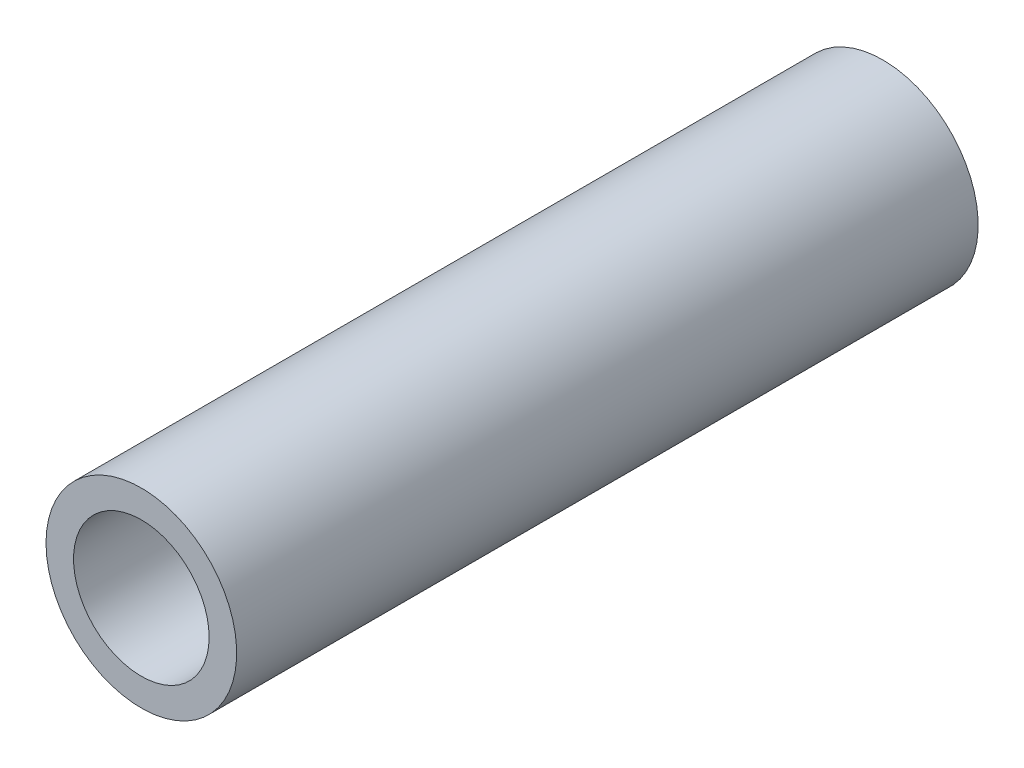
ISO-10303-21;
HEADER;
FILE_DESCRIPTION(('STEP AP214'),'2;1');
FILE_NAME('part.step','',(''),(''),'','','');
FILE_SCHEMA(('AUTOMOTIVE_DESIGN { 1 0 10303 214 1 1 1 1 }'));
ENDSEC;
DATA;
#1=APPLICATION_CONTEXT('core data for automotive mechanical design processes');
#2=APPLICATION_PROTOCOL_DEFINITION('international standard','automotive_design',2000,#1);
#3=PRODUCT_CONTEXT('',#1,'mechanical');
#4=PRODUCT('Part','Part','',(#3));
#5=PRODUCT_RELATED_PRODUCT_CATEGORY('part','',(#4));
#6=PRODUCT_DEFINITION_FORMATION('','',#4);
#7=PRODUCT_DEFINITION_CONTEXT('part definition',#1,'design');
#8=PRODUCT_DEFINITION('design','',#6,#7);
#9=PRODUCT_DEFINITION_SHAPE('','',#8);
#10=(LENGTH_UNIT() NAMED_UNIT(*) SI_UNIT(.MILLI.,.METRE.));
#11=(NAMED_UNIT(*) PLANE_ANGLE_UNIT() SI_UNIT($,.RADIAN.));
#12=(NAMED_UNIT(*) SI_UNIT($,.STERADIAN.) SOLID_ANGLE_UNIT());
#13=UNCERTAINTY_MEASURE_WITH_UNIT(LENGTH_MEASURE(1.E-05),#10,'distance_accuracy_value','');
#14=(GEOMETRIC_REPRESENTATION_CONTEXT(3) GLOBAL_UNCERTAINTY_ASSIGNED_CONTEXT((#13)) GLOBAL_UNIT_ASSIGNED_CONTEXT((#10,
#11,#12)) REPRESENTATION_CONTEXT('',''));
#15=CARTESIAN_POINT('',(0.,0.,0.));
#16=DIRECTION('',(0.,0.,1.));
#17=DIRECTION('',(1.,0.,0.));
#18=AXIS2_PLACEMENT_3D('',#15,#16,#17);
#19=CARTESIAN_POINT('',(0.,0.,19.05));
#20=DIRECTION('',(0.,0.,-1.));
#21=DIRECTION('',(-1.,0.,0.));
#22=AXIS2_PLACEMENT_3D('',#19,#20,#21);
#23=CYLINDRICAL_SURFACE('',#22,5.715);
#24=CARTESIAN_POINT('',(0.,0.,0.));
#25=DIRECTION('',(0.,0.,1.));
#26=DIRECTION('',(1.,0.,0.));
#27=AXIS2_PLACEMENT_3D('',#24,#25,#26);
#28=CIRCLE('',#27,5.715);
#29=CARTESIAN_POINT('',(-5.715,0.,0.));
#30=VERTEX_POINT('',#29);
#31=EDGE_CURVE('E11',#30,#30,#28,.T.);
#32=CARTESIAN_POINT('',(0.,0.,44.45));
#33=DIRECTION('',(0.,0.,1.));
#34=DIRECTION('',(1.,0.,0.));
#35=AXIS2_PLACEMENT_3D('',#32,#33,#34);
#36=CIRCLE('',#35,5.715);
#37=CARTESIAN_POINT('',(-5.715,0.,44.45));
#38=VERTEX_POINT('',#37);
#39=EDGE_CURVE('E81',#38,#38,#36,.T.);
#40=CARTESIAN_POINT('',(-5.715,0.,0.));
#41=CARTESIAN_POINT('',(-5.715,0.,0.463020833333333));
#42=CARTESIAN_POINT('',(-5.715,0.,0.926041666666666));
#43=CARTESIAN_POINT('',(-5.715,0.,1.85208333333333));
#44=CARTESIAN_POINT('',(-5.715,0.,2.31510416666667));
#45=CARTESIAN_POINT('',(-5.715,0.,3.24114583333333));
#46=CARTESIAN_POINT('',(-5.715,0.,3.70416666666667));
#47=CARTESIAN_POINT('',(-5.715,0.,4.63020833333333));
#48=CARTESIAN_POINT('',(-5.715,0.,5.09322916666667));
#49=CARTESIAN_POINT('',(-5.715,0.,6.01927083333333));
#50=CARTESIAN_POINT('',(-5.715,0.,6.48229166666667));
#51=CARTESIAN_POINT('',(-5.715,0.,7.40833333333333));
#52=CARTESIAN_POINT('',(-5.715,0.,7.87135416666667));
#53=CARTESIAN_POINT('',(-5.715,0.,8.79739583333333));
#54=CARTESIAN_POINT('',(-5.715,0.,9.26041666666667));
#55=CARTESIAN_POINT('',(-5.715,0.,10.1864583333333));
#56=CARTESIAN_POINT('',(-5.715,0.,10.6494791666667));
#57=CARTESIAN_POINT('',(-5.715,0.,11.5755208333333));
#58=CARTESIAN_POINT('',(-5.715,0.,12.0385416666667));
#59=CARTESIAN_POINT('',(-5.715,0.,12.9645833333333));
#60=CARTESIAN_POINT('',(-5.715,0.,13.4276041666667));
#61=CARTESIAN_POINT('',(-5.715,0.,14.3536458333333));
#62=CARTESIAN_POINT('',(-5.715,0.,14.8166666666667));
#63=CARTESIAN_POINT('',(-5.715,0.,15.7427083333333));
#64=CARTESIAN_POINT('',(-5.715,0.,16.2057291666667));
#65=CARTESIAN_POINT('',(-5.715,0.,17.1317708333333));
#66=CARTESIAN_POINT('',(-5.715,0.,17.5947916666667));
#67=CARTESIAN_POINT('',(-5.715,0.,18.5208333333333));
#68=CARTESIAN_POINT('',(-5.715,0.,18.9838541666667));
#69=CARTESIAN_POINT('',(-5.715,0.,19.9098958333333));
#70=CARTESIAN_POINT('',(-5.715,0.,20.3729166666667));
#71=CARTESIAN_POINT('',(-5.715,0.,21.2989583333333));
#72=CARTESIAN_POINT('',(-5.715,0.,21.7619791666667));
#73=CARTESIAN_POINT('',(-5.715,0.,22.6880208333333));
#74=CARTESIAN_POINT('',(-5.715,0.,23.1510416666667));
#75=CARTESIAN_POINT('',(-5.715,0.,24.0770833333333));
#76=CARTESIAN_POINT('',(-5.715,0.,24.5401041666667));
#77=CARTESIAN_POINT('',(-5.715,0.,25.4661458333333));
#78=CARTESIAN_POINT('',(-5.715,0.,25.9291666666667));
#79=CARTESIAN_POINT('',(-5.715,0.,26.8552083333333));
#80=CARTESIAN_POINT('',(-5.715,0.,27.3182291666667));
#81=CARTESIAN_POINT('',(-5.715,0.,28.2442708333333));
#82=CARTESIAN_POINT('',(-5.715,0.,28.7072916666667));
#83=CARTESIAN_POINT('',(-5.715,0.,29.6333333333333));
#84=CARTESIAN_POINT('',(-5.715,0.,30.0963541666667));
#85=CARTESIAN_POINT('',(-5.715,0.,31.0223958333333));
#86=CARTESIAN_POINT('',(-5.715,0.,31.4854166666667));
#87=CARTESIAN_POINT('',(-5.715,0.,32.4114583333333));
#88=CARTESIAN_POINT('',(-5.715,0.,32.8744791666667));
#89=CARTESIAN_POINT('',(-5.715,0.,33.8005208333333));
#90=CARTESIAN_POINT('',(-5.715,0.,34.2635416666667));
#91=CARTESIAN_POINT('',(-5.715,0.,35.1895833333333));
#92=CARTESIAN_POINT('',(-5.715,0.,35.6526041666667));
#93=CARTESIAN_POINT('',(-5.715,0.,36.5786458333333));
#94=CARTESIAN_POINT('',(-5.715,0.,37.0416666666667));
#95=CARTESIAN_POINT('',(-5.715,0.,37.9677083333333));
#96=CARTESIAN_POINT('',(-5.715,0.,38.4307291666667));
#97=CARTESIAN_POINT('',(-5.715,0.,39.3567708333333));
#98=CARTESIAN_POINT('',(-5.715,0.,39.8197916666667));
#99=CARTESIAN_POINT('',(-5.715,0.,40.7458333333333));
#100=CARTESIAN_POINT('',(-5.715,0.,41.2088541666667));
#101=CARTESIAN_POINT('',(-5.715,0.,42.1348958333333));
#102=CARTESIAN_POINT('',(-5.715,0.,42.5979166666667));
#103=CARTESIAN_POINT('',(-5.715,0.,43.5239583333333));
#104=CARTESIAN_POINT('',(-5.715,0.,43.9869791666667));
#105=CARTESIAN_POINT('',(-5.715,0.,44.45));
#106=B_SPLINE_CURVE_WITH_KNOTS('',3,(#40,#41,#42,#43,#44,#45,#46,#47,#48,#49,#50,#51,#52,#53,
#54,#55,#56,#57,#58,#59,#60,#61,#62,#63,#64,#65,#66,#67,#68,#69,#70,#71,#72,#73,#74,#75,#76,#77,
#78,#79,#80,#81,#82,#83,#84,#85,#86,#87,#88,#89,#90,#91,#92,#93,#94,#95,#96,#97,#98,#99,#100,
#101,#102,#103,#104,#105),.UNSPECIFIED.,.F.,.F.,(4,2,2,2,2,2,2,2,2,2,2,2,2,2,2,2,2,2,2,2,2,2,2,
2,2,2,2,2,2,2,2,2,4),(0.,1.3890625,2.778125,4.1671875,5.55625,6.9453125,8.334375,9.7234375,
11.1125,12.5015625,13.890625,15.2796875,16.66875,18.0578125,19.446875,20.8359375,22.225,
23.6140625,25.003125,26.3921875,27.78125,29.1703125,30.559375,31.9484375,33.3375,34.7265625,
36.115625,37.5046875,38.89375,40.2828125,41.671875,43.0609375,44.45),.UNSPECIFIED.);
#107=EDGE_CURVE('BSEAM39',#30,#38,#106,.T.);
#108=ORIENTED_EDGE('',*,*,#31,.T.);
#109=ORIENTED_EDGE('',*,*,#39,.F.);
#110=ORIENTED_EDGE('',*,*,#107,.T.);
#111=ORIENTED_EDGE('',*,*,#107,.F.);
#112=EDGE_LOOP('',(#108,#110,#109,#111));
#113=FACE_BOUND('',#112,.T.);
#114=ADVANCED_FACE('F39',(#113),#23,.T.);
#115=CARTESIAN_POINT('',(0.,0.,0.));
#116=DIRECTION('',(0.,0.,1.));
#117=DIRECTION('',(1.,0.,0.));
#118=AXIS2_PLACEMENT_3D('',#115,#116,#117);
#119=PLANE('',#118);
#120=DIRECTION('',(1.,0.,0.));
#121=VECTOR('',#120,1.);
#122=CARTESIAN_POINT('',(1.71068575723305,2.4765,0.));
#123=LINE('',#122,#121);
#124=CARTESIAN_POINT('',(-1.71068575723305,2.4765,0.));
#125=VERTEX_POINT('',#124);
#126=CARTESIAN_POINT('',(1.71068575723305,2.4765,0.));
#127=VERTEX_POINT('',#126);
#128=EDGE_CURVE('E70',#125,#127,#123,.T.);
#129=ORIENTED_EDGE('',*,*,#128,.F.);
#130=CARTESIAN_POINT('',(0.,0.,0.));
#131=DIRECTION('',(0.,0.,-1.));
#132=DIRECTION('',(-1.,0.,0.));
#133=AXIS2_PLACEMENT_3D('',#130,#131,#132);
#134=CIRCLE('',#133,3.0099);
#135=EDGE_CURVE('E53',#127,#125,#134,.T.);
#136=ORIENTED_EDGE('',*,*,#135,.F.);
#137=EDGE_LOOP('',(#129,#136));
#138=FACE_BOUND('',#137,.T.);
#139=ORIENTED_EDGE('',*,*,#31,.F.);
#140=EDGE_LOOP('',(#139));
#141=FACE_BOUND('',#140,.T.);
#142=ADVANCED_FACE('F107',(#138,#141),#119,.F.);
#143=CARTESIAN_POINT('',(0.,0.,19.05));
#144=DIRECTION('',(0.,0.,-1.));
#145=DIRECTION('',(-1.,0.,0.));
#146=AXIS2_PLACEMENT_3D('',#143,#144,#145);
#147=CYLINDRICAL_SURFACE('',#146,3.0099);
#148=ORIENTED_EDGE('',*,*,#135,.T.);
#149=DIRECTION('',(0.,0.,-1.));
#150=VECTOR('',#149,1.);
#151=CARTESIAN_POINT('',(-1.71068575723305,2.4765,19.05));
#152=LINE('',#151,#150);
#153=CARTESIAN_POINT('',(-1.71068575723305,2.4765,19.05));
#154=VERTEX_POINT('',#153);
#155=EDGE_CURVE('E58',#154,#125,#152,.T.);
#156=ORIENTED_EDGE('',*,*,#155,.F.);
#157=CARTESIAN_POINT('',(0.,0.,19.05));
#158=DIRECTION('',(0.,0.,-1.));
#159=DIRECTION('',(-1.,0.,0.));
#160=AXIS2_PLACEMENT_3D('',#157,#158,#159);
#161=CIRCLE('',#160,3.0099);
#162=CARTESIAN_POINT('',(1.71068575723305,2.4765,19.05));
#163=VERTEX_POINT('',#162);
#164=EDGE_CURVE('E72',#163,#154,#161,.T.);
#165=ORIENTED_EDGE('',*,*,#164,.F.);
#166=DIRECTION('',(0.,0.,-1.));
#167=VECTOR('',#166,1.);
#168=CARTESIAN_POINT('',(1.71068575723305,2.4765,19.05));
#169=LINE('',#168,#167);
#170=EDGE_CURVE('E46',#163,#127,#169,.T.);
#171=ORIENTED_EDGE('',*,*,#170,.T.);
#172=EDGE_LOOP('',(#148,#156,#165,#171));
#173=FACE_BOUND('',#172,.T.);
#174=ADVANCED_FACE('F73',(#173),#147,.F.);
#175=CARTESIAN_POINT('',(1.71068575723305,2.4765,19.05));
#176=DIRECTION('',(0.,1.,0.));
#177=DIRECTION('',(0.,0.,1.));
#178=AXIS2_PLACEMENT_3D('',#175,#176,#177);
#179=PLANE('',#178);
#180=ORIENTED_EDGE('',*,*,#128,.T.);
#181=ORIENTED_EDGE('',*,*,#170,.F.);
#182=DIRECTION('',(1.,0.,0.));
#183=VECTOR('',#182,1.);
#184=CARTESIAN_POINT('',(1.71068575723305,2.4765,19.05));
#185=LINE('',#184,#183);
#186=EDGE_CURVE('E67',#154,#163,#185,.T.);
#187=ORIENTED_EDGE('',*,*,#186,.F.);
#188=ORIENTED_EDGE('',*,*,#155,.T.);
#189=EDGE_LOOP('',(#180,#181,#187,#188));
#190=FACE_BOUND('',#189,.T.);
#191=ADVANCED_FACE('F65',(#190),#179,.F.);
#192=CARTESIAN_POINT('',(0.,0.,19.05));
#193=DIRECTION('',(0.,0.,1.));
#194=DIRECTION('',(1.,0.,0.));
#195=AXIS2_PLACEMENT_3D('',#192,#193,#194);
#196=PLANE('',#195);
#197=ORIENTED_EDGE('',*,*,#186,.T.);
#198=ORIENTED_EDGE('',*,*,#164,.T.);
#199=EDGE_LOOP('',(#197,#198));
#200=FACE_BOUND('',#199,.T.);
#201=ADVANCED_FACE('F76',(#200),#196,.F.);
#202=CARTESIAN_POINT('',(0.,0.,44.45));
#203=DIRECTION('',(0.,0.,1.));
#204=DIRECTION('',(1.,0.,0.));
#205=AXIS2_PLACEMENT_3D('',#202,#203,#204);
#206=PLANE('',#205);
#207=CARTESIAN_POINT('',(0.,0.,44.45));
#208=DIRECTION('',(0.,0.,1.));
#209=DIRECTION('',(1.,0.,0.));
#210=AXIS2_PLACEMENT_3D('',#207,#208,#209);
#211=CIRCLE('',#210,4.064);
#212=CARTESIAN_POINT('',(4.064,0.,44.45));
#213=VERTEX_POINT('',#212);
#214=EDGE_CURVE('E87',#213,#213,#211,.T.);
#215=ORIENTED_EDGE('',*,*,#214,.F.);
#216=EDGE_LOOP('',(#215));
#217=FACE_BOUND('',#216,.T.);
#218=ORIENTED_EDGE('',*,*,#39,.T.);
#219=EDGE_LOOP('',(#218));
#220=FACE_BOUND('',#219,.T.);
#221=ADVANCED_FACE('F95',(#217,#220),#206,.T.);
#222=CARTESIAN_POINT('',(0.,0.,25.4));
#223=DIRECTION('',(0.,0.,1.));
#224=DIRECTION('',(1.,0.,0.));
#225=AXIS2_PLACEMENT_3D('',#222,#223,#224);
#226=CYLINDRICAL_SURFACE('',#225,4.064);
#227=CARTESIAN_POINT('',(0.,0.,25.4));
#228=DIRECTION('',(0.,0.,1.));
#229=DIRECTION('',(1.,0.,0.));
#230=AXIS2_PLACEMENT_3D('',#227,#228,#229);
#231=CIRCLE('',#230,4.064);
#232=CARTESIAN_POINT('',(4.064,0.,25.4));
#233=VERTEX_POINT('',#232);
#234=EDGE_CURVE('E83',#233,#233,#231,.T.);
#235=CARTESIAN_POINT('',(4.064,0.,25.4));
#236=CARTESIAN_POINT('',(4.064,0.,25.5984375));
#237=CARTESIAN_POINT('',(4.064,0.,25.796875));
#238=CARTESIAN_POINT('',(4.064,0.,26.19375));
#239=CARTESIAN_POINT('',(4.064,0.,26.3921875));
#240=CARTESIAN_POINT('',(4.064,0.,26.7890625));
#241=CARTESIAN_POINT('',(4.064,0.,26.9875));
#242=CARTESIAN_POINT('',(4.064,0.,27.384375));
#243=CARTESIAN_POINT('',(4.064,0.,27.5828125));
#244=CARTESIAN_POINT('',(4.064,0.,27.9796875));
#245=CARTESIAN_POINT('',(4.064,0.,28.178125));
#246=CARTESIAN_POINT('',(4.064,0.,28.575));
#247=CARTESIAN_POINT('',(4.064,0.,28.7734375));
#248=CARTESIAN_POINT('',(4.064,0.,29.1703125));
#249=CARTESIAN_POINT('',(4.064,0.,29.36875));
#250=CARTESIAN_POINT('',(4.064,0.,29.765625));
#251=CARTESIAN_POINT('',(4.064,0.,29.9640625));
#252=CARTESIAN_POINT('',(4.064,0.,30.3609375));
#253=CARTESIAN_POINT('',(4.064,0.,30.559375));
#254=CARTESIAN_POINT('',(4.064,0.,30.95625));
#255=CARTESIAN_POINT('',(4.064,0.,31.1546875));
#256=CARTESIAN_POINT('',(4.064,0.,31.5515625));
#257=CARTESIAN_POINT('',(4.064,0.,31.75));
#258=CARTESIAN_POINT('',(4.064,0.,32.146875));
#259=CARTESIAN_POINT('',(4.064,0.,32.3453125));
#260=CARTESIAN_POINT('',(4.064,0.,32.7421875));
#261=CARTESIAN_POINT('',(4.064,0.,32.940625));
#262=CARTESIAN_POINT('',(4.064,0.,33.3375));
#263=CARTESIAN_POINT('',(4.064,0.,33.5359375));
#264=CARTESIAN_POINT('',(4.064,0.,33.9328125));
#265=CARTESIAN_POINT('',(4.064,0.,34.13125));
#266=CARTESIAN_POINT('',(4.064,0.,34.528125));
#267=CARTESIAN_POINT('',(4.064,0.,34.7265625));
#268=CARTESIAN_POINT('',(4.064,0.,35.1234375));
#269=CARTESIAN_POINT('',(4.064,0.,35.321875));
#270=CARTESIAN_POINT('',(4.064,0.,35.71875));
#271=CARTESIAN_POINT('',(4.064,0.,35.9171875));
#272=CARTESIAN_POINT('',(4.064,0.,36.3140625));
#273=CARTESIAN_POINT('',(4.064,0.,36.5125));
#274=CARTESIAN_POINT('',(4.064,0.,36.909375));
#275=CARTESIAN_POINT('',(4.064,0.,37.1078125));
#276=CARTESIAN_POINT('',(4.064,0.,37.5046875));
#277=CARTESIAN_POINT('',(4.064,0.,37.703125));
#278=CARTESIAN_POINT('',(4.064,0.,38.1));
#279=CARTESIAN_POINT('',(4.064,0.,38.2984375));
#280=CARTESIAN_POINT('',(4.064,0.,38.6953125));
#281=CARTESIAN_POINT('',(4.064,0.,38.89375));
#282=CARTESIAN_POINT('',(4.064,0.,39.290625));
#283=CARTESIAN_POINT('',(4.064,0.,39.4890625));
#284=CARTESIAN_POINT('',(4.064,0.,39.8859375));
#285=CARTESIAN_POINT('',(4.064,0.,40.084375));
#286=CARTESIAN_POINT('',(4.064,0.,40.48125));
#287=CARTESIAN_POINT('',(4.064,0.,40.6796875));
#288=CARTESIAN_POINT('',(4.064,0.,41.0765625));
#289=CARTESIAN_POINT('',(4.064,0.,41.275));
#290=CARTESIAN_POINT('',(4.064,0.,41.671875));
#291=CARTESIAN_POINT('',(4.064,0.,41.8703125));
#292=CARTESIAN_POINT('',(4.064,0.,42.2671875));
#293=CARTESIAN_POINT('',(4.064,0.,42.465625));
#294=CARTESIAN_POINT('',(4.064,0.,42.8625));
#295=CARTESIAN_POINT('',(4.064,0.,43.0609375));
#296=CARTESIAN_POINT('',(4.064,0.,43.4578125));
#297=CARTESIAN_POINT('',(4.064,0.,43.65625));
#298=CARTESIAN_POINT('',(4.064,0.,44.053125));
#299=CARTESIAN_POINT('',(4.064,0.,44.2515625));
#300=CARTESIAN_POINT('',(4.064,0.,44.45));
#301=B_SPLINE_CURVE_WITH_KNOTS('',3,(#235,#236,#237,#238,#239,#240,#241,#242,#243,#244,#245,
#246,#247,#248,#249,#250,#251,#252,#253,#254,#255,#256,#257,#258,#259,#260,#261,#262,#263,#264,
#265,#266,#267,#268,#269,#270,#271,#272,#273,#274,#275,#276,#277,#278,#279,#280,#281,#282,#283,
#284,#285,#286,#287,#288,#289,#290,#291,#292,#293,#294,#295,#296,#297,#298,#299,#300),
.UNSPECIFIED.,.F.,.F.,(4,2,2,2,2,2,2,2,2,2,2,2,2,2,2,2,2,2,2,2,2,2,2,2,2,2,2,2,2,2,2,2,4),(0.,
0.595312499999997,1.190625,1.7859375,2.38125,2.9765625,3.571875,4.1671875,4.7625,5.3578125,
5.95312499999999,6.54843749999999,7.14374999999999,7.73906249999999,8.33437499999999,
8.92968749999999,9.525,10.1203125,10.715625,11.3109375,11.90625,12.5015625,13.096875,13.6921875,
14.2875,14.8828125,15.478125,16.0734375,16.66875,17.2640625,17.859375,18.4546875,19.05),.UNSPECIFIED.);
#302=EDGE_CURVE('BSEAM93',#233,#213,#301,.T.);
#303=ORIENTED_EDGE('',*,*,#234,.F.);
#304=ORIENTED_EDGE('',*,*,#214,.T.);
#305=ORIENTED_EDGE('',*,*,#302,.T.);
#306=ORIENTED_EDGE('',*,*,#302,.F.);
#307=EDGE_LOOP('',(#303,#305,#304,#306));
#308=FACE_BOUND('',#307,.T.);
#309=ADVANCED_FACE('F93',(#308),#226,.F.);
#310=CARTESIAN_POINT('',(0.,0.,25.4));
#311=DIRECTION('',(0.,0.,1.));
#312=DIRECTION('',(1.,0.,0.));
#313=AXIS2_PLACEMENT_3D('',#310,#311,#312);
#314=PLANE('',#313);
#315=ORIENTED_EDGE('',*,*,#234,.T.);
#316=EDGE_LOOP('',(#315));
#317=FACE_BOUND('',#316,.T.);
#318=ADVANCED_FACE('F102',(#317),#314,.T.);
#319=CLOSED_SHELL('',(#114,#142,#174,#191,#201,#221,#309,#318));
#320=MANIFOLD_SOLID_BREP('B2',#319);
#321=ADVANCED_BREP_SHAPE_REPRESENTATION('',(#18,#320),#14);
#322=SHAPE_DEFINITION_REPRESENTATION(#9,#321);
ENDSEC;
END-ISO-10303-21;
